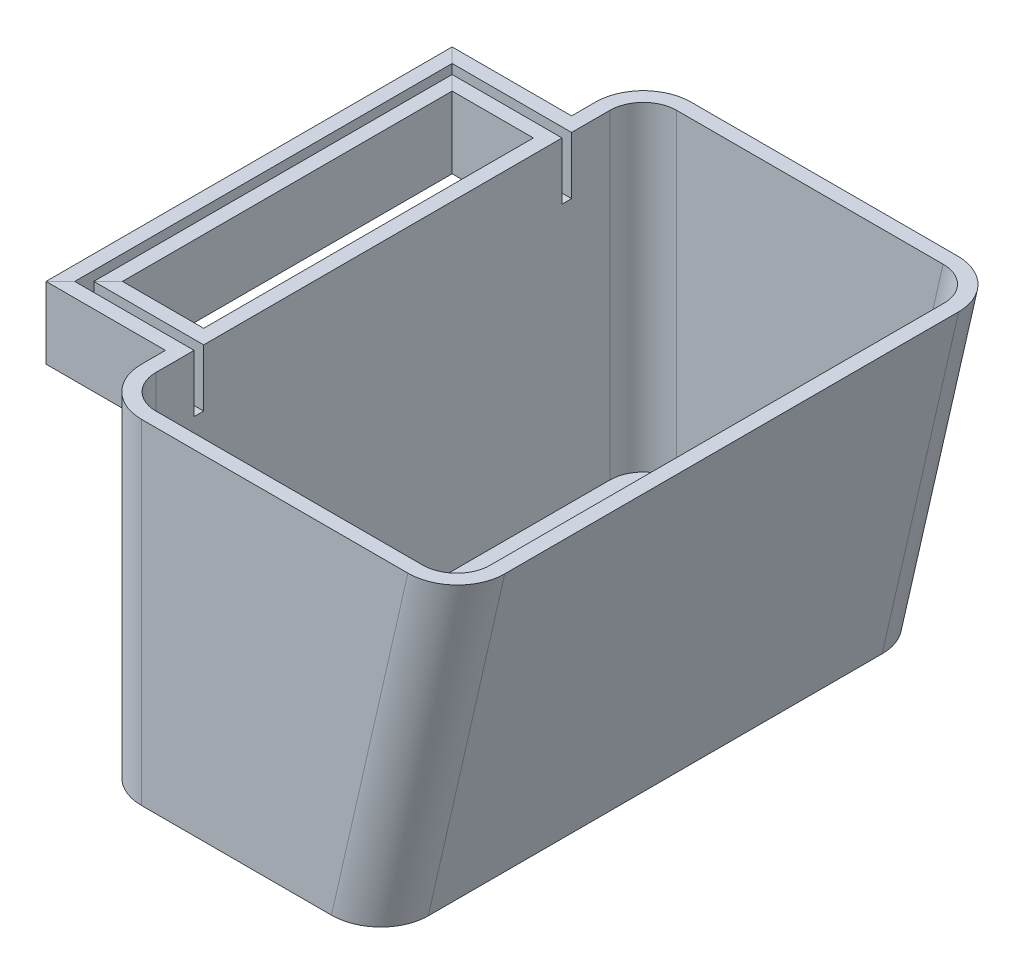
ISO-10303-21;
HEADER;
FILE_DESCRIPTION(('STEP AP214'),'2;1');
FILE_NAME('part.step','',(''),(''),'','','');
FILE_SCHEMA(('AUTOMOTIVE_DESIGN { 1 0 10303 214 1 1 1 1 }'));
ENDSEC;
DATA;
#1=APPLICATION_CONTEXT('core data for automotive mechanical design processes');
#2=APPLICATION_PROTOCOL_DEFINITION('international standard','automotive_design',2000,#1);
#3=PRODUCT_CONTEXT('',#1,'mechanical');
#4=PRODUCT('Part','Part','',(#3));
#5=PRODUCT_RELATED_PRODUCT_CATEGORY('part','',(#4));
#6=PRODUCT_DEFINITION_FORMATION('','',#4);
#7=PRODUCT_DEFINITION_CONTEXT('part definition',#1,'design');
#8=PRODUCT_DEFINITION('design','',#6,#7);
#9=PRODUCT_DEFINITION_SHAPE('','',#8);
#10=(LENGTH_UNIT() NAMED_UNIT(*) SI_UNIT(.MILLI.,.METRE.));
#11=(NAMED_UNIT(*) PLANE_ANGLE_UNIT() SI_UNIT($,.RADIAN.));
#12=(NAMED_UNIT(*) SI_UNIT($,.STERADIAN.) SOLID_ANGLE_UNIT());
#13=UNCERTAINTY_MEASURE_WITH_UNIT(LENGTH_MEASURE(1.E-05),#10,'distance_accuracy_value','');
#14=(GEOMETRIC_REPRESENTATION_CONTEXT(3) GLOBAL_UNCERTAINTY_ASSIGNED_CONTEXT((#13)) GLOBAL_UNIT_ASSIGNED_CONTEXT((#10,
#11,#12)) REPRESENTATION_CONTEXT('',''));
#15=CARTESIAN_POINT('',(0.,0.,0.));
#16=DIRECTION('',(0.,0.,1.));
#17=DIRECTION('',(1.,0.,0.));
#18=AXIS2_PLACEMENT_3D('',#15,#16,#17);
#19=CARTESIAN_POINT('',(0.,70.,115.));
#20=DIRECTION('',(0.,-1.,0.));
#21=DIRECTION('',(0.,0.,-1.));
#22=AXIS2_PLACEMENT_3D('',#19,#20,#21);
#23=PLANE('',#22);
#24=DIRECTION('',(0.,0.,-1.));
#25=VECTOR('',#24,1.);
#26=CARTESIAN_POINT('',(3.,70.,115.));
#27=LINE('',#26,#25);
#28=CARTESIAN_POINT('',(3.,70.,95.));
#29=VERTEX_POINT('',#28);
#30=CARTESIAN_POINT('',(3.,70.,20.));
#31=VERTEX_POINT('',#30);
#32=EDGE_CURVE('E398',#29,#31,#27,.T.);
#33=ORIENTED_EDGE('',*,*,#32,.T.);
#34=DIRECTION('',(-1.,0.,0.));
#35=VECTOR('',#34,1.);
#36=CARTESIAN_POINT('',(0.,70.,20.));
#37=LINE('',#36,#35);
#38=CARTESIAN_POINT('',(-20.,70.,20.));
#39=VERTEX_POINT('',#38);
#40=EDGE_CURVE('E296',#31,#39,#37,.T.);
#41=ORIENTED_EDGE('',*,*,#40,.T.);
#42=DIRECTION('',(0.707106781186548,0.,0.707106781186547));
#43=VECTOR('',#42,1.);
#44=CARTESIAN_POINT('',(-8.5,70.,31.5));
#45=LINE('',#44,#43);
#46=CARTESIAN_POINT('',(-17.,70.,23.));
#47=VERTEX_POINT('',#46);
#48=EDGE_CURVE('E466',#39,#47,#45,.T.);
#49=ORIENTED_EDGE('',*,*,#48,.T.);
#50=DIRECTION('',(-1.,0.,0.));
#51=VECTOR('',#50,1.);
#52=CARTESIAN_POINT('',(0.,70.,23.));
#53=LINE('',#52,#51);
#54=CARTESIAN_POINT('',(0.,70.,23.));
#55=VERTEX_POINT('',#54);
#56=EDGE_CURVE('E441',#55,#47,#53,.T.);
#57=ORIENTED_EDGE('',*,*,#56,.F.);
#58=DIRECTION('',(0.,0.,-1.));
#59=VECTOR('',#58,1.);
#60=CARTESIAN_POINT('',(0.,70.,115.));
#61=LINE('',#60,#59);
#62=CARTESIAN_POINT('',(0.,70.,92.));
#63=VERTEX_POINT('',#62);
#64=EDGE_CURVE('E562',#63,#55,#61,.T.);
#65=ORIENTED_EDGE('',*,*,#64,.F.);
#66=DIRECTION('',(1.,0.,0.));
#67=VECTOR('',#66,1.);
#68=CARTESIAN_POINT('',(-25.,70.,92.));
#69=LINE('',#68,#67);
#70=CARTESIAN_POINT('',(-17.,70.,92.));
#71=VERTEX_POINT('',#70);
#72=EDGE_CURVE('E503',#71,#63,#69,.T.);
#73=ORIENTED_EDGE('',*,*,#72,.F.);
#74=DIRECTION('',(0.707106781186548,0.,-0.707106781186548));
#75=VECTOR('',#74,1.);
#76=CARTESIAN_POINT('',(21.5,70.,53.5));
#77=LINE('',#76,#75);
#78=CARTESIAN_POINT('',(-20.,70.,95.));
#79=VERTEX_POINT('',#78);
#80=EDGE_CURVE('E498',#79,#71,#77,.T.);
#81=ORIENTED_EDGE('',*,*,#80,.F.);
#82=DIRECTION('',(1.,0.,0.));
#83=VECTOR('',#82,1.);
#84=CARTESIAN_POINT('',(0.,70.,95.));
#85=LINE('',#84,#83);
#86=EDGE_CURVE('E67',#79,#29,#85,.T.);
#87=ORIENTED_EDGE('',*,*,#86,.T.);
#88=EDGE_LOOP('',(#33,#41,#49,#57,#65,#73,#81,#87));
#89=FACE_BOUND('',#88,.T.);
#90=ADVANCED_FACE('F43',(#89),#23,.F.);
#91=CARTESIAN_POINT('',(-17.,70.,15.));
#92=DIRECTION('',(0.,1.,0.));
#93=DIRECTION('',(0.,0.,1.));
#94=AXIS2_PLACEMENT_3D('',#91,#92,#93);
#95=PLANE('',#94);
#96=ORIENTED_EDGE('',*,*,#48,.F.);
#97=DIRECTION('',(0.,0.,1.));
#98=VECTOR('',#97,1.);
#99=CARTESIAN_POINT('',(-20.,70.,15.));
#100=LINE('',#99,#98);
#101=EDGE_CURVE('E368',#39,#79,#100,.T.);
#102=ORIENTED_EDGE('',*,*,#101,.T.);
#103=ORIENTED_EDGE('',*,*,#80,.T.);
#104=DIRECTION('',(0.,0.,1.));
#105=VECTOR('',#104,1.);
#106=CARTESIAN_POINT('',(-17.,70.,15.));
#107=LINE('',#106,#105);
#108=EDGE_CURVE('E487',#47,#71,#107,.T.);
#109=ORIENTED_EDGE('',*,*,#108,.F.);
#110=EDGE_LOOP('',(#96,#102,#103,#109));
#111=FACE_BOUND('',#110,.T.);
#112=ADVANCED_FACE('F691',(#111),#95,.T.);
#113=CARTESIAN_POINT('',(0.,0.,115.));
#114=DIRECTION('',(1.,0.,0.));
#115=DIRECTION('',(0.,0.,-1.));
#116=AXIS2_PLACEMENT_3D('',#113,#114,#115);
#117=PLANE('',#116);
#118=CARTESIAN_POINT('',(0.,70.,15.));
#119=VERTEX_POINT('',#118);
#120=CARTESIAN_POINT('',(0.,70.,9.99999999999999));
#121=VERTEX_POINT('',#120);
#122=EDGE_CURVE('E557',#119,#121,#61,.T.);
#123=ORIENTED_EDGE('',*,*,#122,.T.);
#124=DIRECTION('',(0.,-1.,0.));
#125=VECTOR('',#124,1.);
#126=CARTESIAN_POINT('',(0.,0.,9.99999999999999));
#127=LINE('',#126,#125);
#128=CARTESIAN_POINT('',(0.,0.,9.99999999999999));
#129=VERTEX_POINT('',#128);
#130=EDGE_CURVE('E597',#121,#129,#127,.T.);
#131=ORIENTED_EDGE('',*,*,#130,.T.);
#132=DIRECTION('',(0.,0.,-1.));
#133=VECTOR('',#132,1.);
#134=CARTESIAN_POINT('',(0.,0.,115.));
#135=LINE('',#134,#133);
#136=CARTESIAN_POINT('',(0.,0.,105.));
#137=VERTEX_POINT('',#136);
#138=EDGE_CURVE('E547',#137,#129,#135,.T.);
#139=ORIENTED_EDGE('',*,*,#138,.F.);
#140=DIRECTION('',(0.,-1.,0.));
#141=VECTOR('',#140,1.);
#142=CARTESIAN_POINT('',(0.,0.,105.));
#143=LINE('',#142,#141);
#144=CARTESIAN_POINT('',(0.,70.,105.));
#145=VERTEX_POINT('',#144);
#146=EDGE_CURVE('E577',#137,#145,#143,.F.);
#147=ORIENTED_EDGE('',*,*,#146,.T.);
#148=CARTESIAN_POINT('',(0.,70.,100.));
#149=VERTEX_POINT('',#148);
#150=EDGE_CURVE('E558',#145,#149,#61,.T.);
#151=ORIENTED_EDGE('',*,*,#150,.T.);
#152=DIRECTION('',(0.,-1.,0.));
#153=VECTOR('',#152,1.);
#154=CARTESIAN_POINT('',(0.,70.,100.));
#155=LINE('',#154,#153);
#156=CARTESIAN_POINT('',(0.,55.,100.));
#157=VERTEX_POINT('',#156);
#158=EDGE_CURVE('E526',#149,#157,#155,.T.);
#159=ORIENTED_EDGE('',*,*,#158,.T.);
#160=DIRECTION('',(0.,0.,-1.));
#161=VECTOR('',#160,1.);
#162=CARTESIAN_POINT('',(0.,55.,100.));
#163=LINE('',#162,#161);
#164=CARTESIAN_POINT('',(0.,55.,92.));
#165=VERTEX_POINT('',#164);
#166=EDGE_CURVE('E518',#157,#165,#163,.T.);
#167=ORIENTED_EDGE('',*,*,#166,.T.);
#168=DIRECTION('',(0.,1.,0.));
#169=VECTOR('',#168,1.);
#170=CARTESIAN_POINT('',(0.,55.,92.));
#171=LINE('',#170,#169);
#172=EDGE_CURVE('E338',#165,#63,#171,.T.);
#173=ORIENTED_EDGE('',*,*,#172,.T.);
#174=ORIENTED_EDGE('',*,*,#64,.T.);
#175=DIRECTION('',(0.,1.,0.));
#176=VECTOR('',#175,1.);
#177=CARTESIAN_POINT('',(0.,55.,23.));
#178=LINE('',#177,#176);
#179=CARTESIAN_POINT('',(0.,55.,23.));
#180=VERTEX_POINT('',#179);
#181=EDGE_CURVE('E436',#180,#55,#178,.T.);
#182=ORIENTED_EDGE('',*,*,#181,.F.);
#183=DIRECTION('',(0.,0.,1.));
#184=VECTOR('',#183,1.);
#185=CARTESIAN_POINT('',(0.,55.,15.));
#186=LINE('',#185,#184);
#187=CARTESIAN_POINT('',(0.,55.,15.));
#188=VERTEX_POINT('',#187);
#189=EDGE_CURVE('E440',#188,#180,#186,.T.);
#190=ORIENTED_EDGE('',*,*,#189,.F.);
#191=DIRECTION('',(0.,-1.,0.));
#192=VECTOR('',#191,1.);
#193=CARTESIAN_POINT('',(0.,70.,15.));
#194=LINE('',#193,#192);
#195=EDGE_CURVE('E445',#119,#188,#194,.T.);
#196=ORIENTED_EDGE('',*,*,#195,.F.);
#197=EDGE_LOOP('',(#123,#131,#139,#147,#151,#159,#167,#173,#174,#182,#190,#196));
#198=FACE_BOUND('',#197,.T.);
#199=ADVANCED_FACE('F627',(#198),#117,.F.);
#200=CARTESIAN_POINT('',(60.,0.,115.));
#201=DIRECTION('',(0.,1.,0.));
#202=DIRECTION('',(-1.,0.,0.));
#203=AXIS2_PLACEMENT_3D('',#200,#201,#202);
#204=PLANE('',#203);
#205=ORIENTED_EDGE('',*,*,#138,.T.);
#206=CARTESIAN_POINT('',(10.,0.,9.99999999999999));
#207=DIRECTION('',(0.,1.,0.));
#208=DIRECTION('',(-1.,0.,0.));
#209=AXIS2_PLACEMENT_3D('',#206,#207,#208);
#210=CIRCLE('',#209,10.);
#211=CARTESIAN_POINT('',(10.,0.,0.));
#212=VERTEX_POINT('',#211);
#213=EDGE_CURVE('E604',#129,#212,#210,.F.);
#214=ORIENTED_EDGE('',*,*,#213,.T.);
#215=DIRECTION('',(1.,0.,0.));
#216=VECTOR('',#215,1.);
#217=CARTESIAN_POINT('',(60.,0.,0.));
#218=LINE('',#217,#216);
#219=CARTESIAN_POINT('',(49.7421011022764,0.,0.));
#220=VERTEX_POINT('',#219);
#221=EDGE_CURVE('E458',#212,#220,#218,.T.);
#222=ORIENTED_EDGE('',*,*,#221,.T.);
#223=CARTESIAN_POINT('',(49.7421011022764,0.,9.99999999999999));
#224=DIRECTION('',(0.,1.,0.));
#225=DIRECTION('',(-1.,0.,0.));
#226=AXIS2_PLACEMENT_3D('',#223,#224,#225);
#227=ELLIPSE('',#226,10.2578988977236,10.);
#228=CARTESIAN_POINT('',(60.,0.,9.99999999999999));
#229=VERTEX_POINT('',#228);
#230=EDGE_CURVE('E601',#220,#229,#227,.F.);
#231=ORIENTED_EDGE('',*,*,#230,.T.);
#232=DIRECTION('',(0.,0.,-1.));
#233=VECTOR('',#232,1.);
#234=CARTESIAN_POINT('',(60.,0.,115.));
#235=LINE('',#234,#233);
#236=CARTESIAN_POINT('',(60.,0.,105.));
#237=VERTEX_POINT('',#236);
#238=EDGE_CURVE('E566',#237,#229,#235,.T.);
#239=ORIENTED_EDGE('',*,*,#238,.F.);
#240=CARTESIAN_POINT('',(49.7421011022764,0.,105.));
#241=DIRECTION('',(0.,1.,0.));
#242=DIRECTION('',(1.,0.,0.));
#243=AXIS2_PLACEMENT_3D('',#240,#241,#242);
#244=ELLIPSE('',#243,10.2578988977236,10.);
#245=CARTESIAN_POINT('',(49.7421011022764,0.,115.));
#246=VERTEX_POINT('',#245);
#247=EDGE_CURVE('E594',#237,#246,#244,.F.);
#248=ORIENTED_EDGE('',*,*,#247,.T.);
#249=DIRECTION('',(1.,0.,0.));
#250=VECTOR('',#249,1.);
#251=CARTESIAN_POINT('',(60.,0.,115.));
#252=LINE('',#251,#250);
#253=CARTESIAN_POINT('',(10.,0.,115.));
#254=VERTEX_POINT('',#253);
#255=EDGE_CURVE('E539',#254,#246,#252,.T.);
#256=ORIENTED_EDGE('',*,*,#255,.F.);
#257=CARTESIAN_POINT('',(10.,0.,105.));
#258=DIRECTION('',(0.,1.,0.));
#259=DIRECTION('',(-1.,0.,0.));
#260=AXIS2_PLACEMENT_3D('',#257,#258,#259);
#261=CIRCLE('',#260,10.);
#262=EDGE_CURVE('E574',#254,#137,#261,.F.);
#263=ORIENTED_EDGE('',*,*,#262,.T.);
#264=EDGE_LOOP('',(#205,#214,#222,#231,#239,#248,#256,#263));
#265=FACE_BOUND('',#264,.T.);
#266=ADVANCED_FACE('F633',(#265),#204,.F.);
#267=CARTESIAN_POINT('',(76.,70.,115.));
#268=DIRECTION('',(-0.974858506571867,0.222824801502141,0.));
#269=DIRECTION('',(-0.222824801502141,-0.974858506571867,0.));
#270=AXIS2_PLACEMENT_3D('',#267,#268,#269);
#271=PLANE('',#270);
#272=ORIENTED_EDGE('',*,*,#238,.T.);
#273=DIRECTION('',(0.222824801502141,0.974858506571867,0.));
#274=VECTOR('',#273,1.);
#275=CARTESIAN_POINT('',(76.,70.,9.99999999999999));
#276=LINE('',#275,#274);
#277=CARTESIAN_POINT('',(76.,70.,9.99999999999999));
#278=VERTEX_POINT('',#277);
#279=EDGE_CURVE('E11',#229,#278,#276,.T.);
#280=ORIENTED_EDGE('',*,*,#279,.T.);
#281=DIRECTION('',(0.,0.,-1.));
#282=VECTOR('',#281,1.);
#283=CARTESIAN_POINT('',(76.,70.,115.));
#284=LINE('',#283,#282);
#285=CARTESIAN_POINT('',(76.,70.,105.));
#286=VERTEX_POINT('',#285);
#287=EDGE_CURVE('E561',#286,#278,#284,.T.);
#288=ORIENTED_EDGE('',*,*,#287,.F.);
#289=DIRECTION('',(0.222824801502141,0.974858506571867,0.));
#290=VECTOR('',#289,1.);
#291=CARTESIAN_POINT('',(76.,70.,105.));
#292=LINE('',#291,#290);
#293=EDGE_CURVE('E591',#286,#237,#292,.F.);
#294=ORIENTED_EDGE('',*,*,#293,.T.);
#295=EDGE_LOOP('',(#272,#280,#288,#294));
#296=FACE_BOUND('',#295,.T.);
#297=ADVANCED_FACE('F643',(#296),#271,.F.);
#298=DIRECTION('',(-1.,0.,0.));
#299=VECTOR('',#298,1.);
#300=CARTESIAN_POINT('',(0.,70.,18.));
#301=LINE('',#300,#299);
#302=CARTESIAN_POINT('',(3.,70.,18.));
#303=VERTEX_POINT('',#302);
#304=CARTESIAN_POINT('',(-22.,70.,18.));
#305=VERTEX_POINT('',#304);
#306=EDGE_CURVE('E59',#303,#305,#301,.T.);
#307=ORIENTED_EDGE('',*,*,#306,.F.);
#308=DIRECTION('',(0.,0.,-1.));
#309=VECTOR('',#308,1.);
#310=CARTESIAN_POINT('',(3.,70.,115.));
#311=LINE('',#310,#309);
#312=CARTESIAN_POINT('',(3.,70.,9.99999999999999));
#313=VERTEX_POINT('',#312);
#314=EDGE_CURVE('E394',#303,#313,#311,.T.);
#315=ORIENTED_EDGE('',*,*,#314,.T.);
#316=CARTESIAN_POINT('',(10.,70.,9.99999999999999));
#317=DIRECTION('',(0.,-1.,0.));
#318=DIRECTION('',(0.,0.,-1.));
#319=AXIS2_PLACEMENT_3D('',#316,#317,#318);
#320=CIRCLE('',#319,7.);
#321=CARTESIAN_POINT('',(10.,70.,3.));
#322=VERTEX_POINT('',#321);
#323=EDGE_CURVE('E339',#322,#313,#320,.F.);
#324=ORIENTED_EDGE('',*,*,#323,.F.);
#325=DIRECTION('',(-1.,0.,0.));
#326=VECTOR('',#325,1.);
#327=CARTESIAN_POINT('',(0.,70.,3.));
#328=LINE('',#327,#326);
#329=CARTESIAN_POINT('',(65.7421011022764,70.,3.));
#330=VERTEX_POINT('',#329);
#331=EDGE_CURVE('E313',#330,#322,#328,.T.);
#332=ORIENTED_EDGE('',*,*,#331,.F.);
#333=CARTESIAN_POINT('',(65.7421011022764,70.,9.99999999999999));
#334=DIRECTION('',(0.,-1.,0.));
#335=DIRECTION('',(-1.,0.,0.));
#336=AXIS2_PLACEMENT_3D('',#333,#334,#335);
#337=ELLIPSE('',#336,7.1805292284065,7.);
#338=CARTESIAN_POINT('',(72.9226303306829,70.,9.99999999999999));
#339=VERTEX_POINT('',#338);
#340=EDGE_CURVE('E354',#339,#330,#337,.F.);
#341=ORIENTED_EDGE('',*,*,#340,.F.);
#342=DIRECTION('',(0.,0.,-1.));
#343=VECTOR('',#342,1.);
#344=CARTESIAN_POINT('',(72.9226303306829,70.,115.));
#345=LINE('',#344,#343);
#346=CARTESIAN_POINT('',(72.9226303306829,70.,105.));
#347=VERTEX_POINT('',#346);
#348=EDGE_CURVE('E322',#347,#339,#345,.T.);
#349=ORIENTED_EDGE('',*,*,#348,.F.);
#350=CARTESIAN_POINT('',(65.7421011022764,70.,105.));
#351=DIRECTION('',(0.,-1.,0.));
#352=DIRECTION('',(1.,0.,0.));
#353=AXIS2_PLACEMENT_3D('',#350,#351,#352);
#354=ELLIPSE('',#353,7.1805292284065,7.);
#355=CARTESIAN_POINT('',(65.7421011022764,70.,112.));
#356=VERTEX_POINT('',#355);
#357=EDGE_CURVE('E342',#356,#347,#354,.F.);
#358=ORIENTED_EDGE('',*,*,#357,.F.);
#359=DIRECTION('',(-1.,0.,0.));
#360=VECTOR('',#359,1.);
#361=CARTESIAN_POINT('',(0.,70.,112.));
#362=LINE('',#361,#360);
#363=CARTESIAN_POINT('',(10.,70.,112.));
#364=VERTEX_POINT('',#363);
#365=EDGE_CURVE('E331',#356,#364,#362,.T.);
#366=ORIENTED_EDGE('',*,*,#365,.T.);
#367=CARTESIAN_POINT('',(10.,70.,105.));
#368=DIRECTION('',(0.,-1.,0.));
#369=DIRECTION('',(0.,0.,-1.));
#370=AXIS2_PLACEMENT_3D('',#367,#368,#369);
#371=CIRCLE('',#370,7.);
#372=CARTESIAN_POINT('',(3.,70.,105.));
#373=VERTEX_POINT('',#372);
#374=EDGE_CURVE('E346',#373,#364,#371,.F.);
#375=ORIENTED_EDGE('',*,*,#374,.F.);
#376=DIRECTION('',(0.,0.,-1.));
#377=VECTOR('',#376,1.);
#378=CARTESIAN_POINT('',(3.,70.,115.));
#379=LINE('',#378,#377);
#380=CARTESIAN_POINT('',(3.,70.,97.));
#381=VERTEX_POINT('',#380);
#382=EDGE_CURVE('E405',#373,#381,#379,.T.);
#383=ORIENTED_EDGE('',*,*,#382,.T.);
#384=DIRECTION('',(1.,0.,0.));
#385=VECTOR('',#384,1.);
#386=CARTESIAN_POINT('',(-25.,70.,97.));
#387=LINE('',#386,#385);
#388=CARTESIAN_POINT('',(-22.,70.,97.));
#389=VERTEX_POINT('',#388);
#390=EDGE_CURVE('E280',#389,#381,#387,.T.);
#391=ORIENTED_EDGE('',*,*,#390,.F.);
#392=CARTESIAN_POINT('',(-25.,70.,100.));
#393=VERTEX_POINT('',#392);
#394=EDGE_CURVE('E504',#393,#389,#77,.T.);
#395=ORIENTED_EDGE('',*,*,#394,.F.);
#396=DIRECTION('',(1.,0.,0.));
#397=VECTOR('',#396,1.);
#398=CARTESIAN_POINT('',(-25.,70.,100.));
#399=LINE('',#398,#397);
#400=EDGE_CURVE('E530',#393,#149,#399,.T.);
#401=ORIENTED_EDGE('',*,*,#400,.T.);
#402=ORIENTED_EDGE('',*,*,#150,.F.);
#403=CARTESIAN_POINT('',(10.,70.,105.));
#404=DIRECTION('',(0.,-1.,0.));
#405=DIRECTION('',(0.,0.,-1.));
#406=AXIS2_PLACEMENT_3D('',#403,#404,#405);
#407=CIRCLE('',#406,10.);
#408=CARTESIAN_POINT('',(10.,70.,115.));
#409=VERTEX_POINT('',#408);
#410=EDGE_CURVE('E580',#145,#409,#407,.F.);
#411=ORIENTED_EDGE('',*,*,#410,.T.);
#412=DIRECTION('',(-1.,0.,0.));
#413=VECTOR('',#412,1.);
#414=CARTESIAN_POINT('',(0.,70.,115.));
#415=LINE('',#414,#413);
#416=CARTESIAN_POINT('',(65.7421011022764,70.,115.));
#417=VERTEX_POINT('',#416);
#418=EDGE_CURVE('E543',#417,#409,#415,.T.);
#419=ORIENTED_EDGE('',*,*,#418,.F.);
#420=CARTESIAN_POINT('',(65.7421011022764,70.,105.));
#421=DIRECTION('',(0.,-1.,0.));
#422=DIRECTION('',(1.,0.,0.));
#423=AXIS2_PLACEMENT_3D('',#420,#421,#422);
#424=ELLIPSE('',#423,10.2578988977236,10.);
#425=EDGE_CURVE('E588',#417,#286,#424,.F.);
#426=ORIENTED_EDGE('',*,*,#425,.T.);
#427=ORIENTED_EDGE('',*,*,#287,.T.);
#428=CARTESIAN_POINT('',(65.7421011022764,70.,9.99999999999999));
#429=DIRECTION('',(0.,-1.,0.));
#430=DIRECTION('',(-1.,0.,0.));
#431=AXIS2_PLACEMENT_3D('',#428,#429,#430);
#432=ELLIPSE('',#431,10.2578988977236,10.);
#433=CARTESIAN_POINT('',(65.7421011022764,70.,0.));
#434=VERTEX_POINT('',#433);
#435=EDGE_CURVE('E613',#278,#434,#432,.F.);
#436=ORIENTED_EDGE('',*,*,#435,.T.);
#437=DIRECTION('',(-1.,0.,0.));
#438=VECTOR('',#437,1.);
#439=CARTESIAN_POINT('',(0.,70.,0.));
#440=LINE('',#439,#438);
#441=CARTESIAN_POINT('',(10.,70.,0.));
#442=VERTEX_POINT('',#441);
#443=EDGE_CURVE('E544',#434,#442,#440,.T.);
#444=ORIENTED_EDGE('',*,*,#443,.T.);
#445=CARTESIAN_POINT('',(10.,70.,9.99999999999999));
#446=DIRECTION('',(0.,-1.,0.));
#447=DIRECTION('',(0.,0.,-1.));
#448=AXIS2_PLACEMENT_3D('',#445,#446,#447);
#449=CIRCLE('',#448,10.);
#450=EDGE_CURVE('E52',#442,#121,#449,.F.);
#451=ORIENTED_EDGE('',*,*,#450,.T.);
#452=ORIENTED_EDGE('',*,*,#122,.F.);
#453=DIRECTION('',(-1.,0.,0.));
#454=VECTOR('',#453,1.);
#455=CARTESIAN_POINT('',(0.,70.,15.));
#456=LINE('',#455,#454);
#457=CARTESIAN_POINT('',(-25.,70.,15.));
#458=VERTEX_POINT('',#457);
#459=EDGE_CURVE('E454',#119,#458,#456,.T.);
#460=ORIENTED_EDGE('',*,*,#459,.T.);
#461=EDGE_CURVE('E472',#458,#305,#45,.T.);
#462=ORIENTED_EDGE('',*,*,#461,.T.);
#463=EDGE_LOOP('',(#307,#315,#324,#332,#341,#349,#358,#366,#375,#383,#391,#395,#401,#402,#411,
#419,#426,#427,#436,#444,#451,#452,#460,#462));
#464=FACE_BOUND('',#463,.T.);
#465=ADVANCED_FACE('F620',(#464),#23,.F.);
#466=CARTESIAN_POINT('',(0.,0.,115.));
#467=DIRECTION('',(0.,0.,-1.));
#468=DIRECTION('',(-1.,0.,0.));
#469=AXIS2_PLACEMENT_3D('',#466,#467,#468);
#470=PLANE('',#469);
#471=ORIENTED_EDGE('',*,*,#255,.T.);
#472=DIRECTION('',(0.222824801502141,0.974858506571867,0.));
#473=VECTOR('',#472,1.);
#474=CARTESIAN_POINT('',(47.2723614044132,-10.8051111781516,115.));
#475=LINE('',#474,#473);
#476=EDGE_CURVE('E584',#246,#417,#475,.T.);
#477=ORIENTED_EDGE('',*,*,#476,.T.);
#478=ORIENTED_EDGE('',*,*,#418,.T.);
#479=DIRECTION('',(0.,-1.,0.));
#480=VECTOR('',#479,1.);
#481=CARTESIAN_POINT('',(10.,0.,115.));
#482=LINE('',#481,#480);
#483=EDGE_CURVE('E570',#409,#254,#482,.T.);
#484=ORIENTED_EDGE('',*,*,#483,.T.);
#485=EDGE_LOOP('',(#471,#477,#478,#484));
#486=FACE_BOUND('',#485,.T.);
#487=ADVANCED_FACE('F651',(#486),#470,.F.);
#488=CARTESIAN_POINT('',(0.,0.,0.));
#489=DIRECTION('',(0.,0.,-1.));
#490=DIRECTION('',(-1.,0.,0.));
#491=AXIS2_PLACEMENT_3D('',#488,#489,#490);
#492=PLANE('',#491);
#493=ORIENTED_EDGE('',*,*,#221,.F.);
#494=DIRECTION('',(0.,-1.,0.));
#495=VECTOR('',#494,1.);
#496=CARTESIAN_POINT('',(10.,70.,0.));
#497=LINE('',#496,#495);
#498=EDGE_CURVE('E610',#212,#442,#497,.F.);
#499=ORIENTED_EDGE('',*,*,#498,.T.);
#500=ORIENTED_EDGE('',*,*,#443,.F.);
#501=DIRECTION('',(0.222824801502141,0.974858506571867,0.));
#502=VECTOR('',#501,1.);
#503=CARTESIAN_POINT('',(50.2514149342813,2.2282480150214,0.));
#504=LINE('',#503,#502);
#505=EDGE_CURVE('E607',#434,#220,#504,.F.);
#506=ORIENTED_EDGE('',*,*,#505,.T.);
#507=EDGE_LOOP('',(#493,#499,#500,#506));
#508=FACE_BOUND('',#507,.T.);
#509=ADVANCED_FACE('F636',(#508),#492,.T.);
#510=CARTESIAN_POINT('',(-25.,70.,100.));
#511=DIRECTION('',(0.,0.,1.));
#512=DIRECTION('',(0.,-1.,0.));
#513=AXIS2_PLACEMENT_3D('',#510,#511,#512);
#514=PLANE('',#513);
#515=DIRECTION('',(1.,0.,0.));
#516=VECTOR('',#515,1.);
#517=CARTESIAN_POINT('',(-25.,55.,100.));
#518=LINE('',#517,#516);
#519=CARTESIAN_POINT('',(-25.,55.,100.));
#520=VERTEX_POINT('',#519);
#521=EDGE_CURVE('E522',#520,#157,#518,.T.);
#522=ORIENTED_EDGE('',*,*,#521,.T.);
#523=ORIENTED_EDGE('',*,*,#158,.F.);
#524=ORIENTED_EDGE('',*,*,#400,.F.);
#525=DIRECTION('',(0.,-1.,0.));
#526=VECTOR('',#525,1.);
#527=CARTESIAN_POINT('',(-25.,70.,100.));
#528=LINE('',#527,#526);
#529=EDGE_CURVE('E486',#393,#520,#528,.T.);
#530=ORIENTED_EDGE('',*,*,#529,.T.);
#531=EDGE_LOOP('',(#522,#523,#524,#530));
#532=FACE_BOUND('',#531,.T.);
#533=ADVANCED_FACE('F663',(#532),#514,.T.);
#534=CARTESIAN_POINT('',(-25.,55.,100.));
#535=DIRECTION('',(0.,-1.,0.));
#536=DIRECTION('',(0.,0.,-1.));
#537=AXIS2_PLACEMENT_3D('',#534,#535,#536);
#538=PLANE('',#537);
#539=DIRECTION('',(-0.707106781186548,0.,0.707106781186548));
#540=VECTOR('',#539,1.);
#541=CARTESIAN_POINT('',(17.5,55.,57.5));
#542=LINE('',#541,#540);
#543=CARTESIAN_POINT('',(-17.,55.,92.));
#544=VERTEX_POINT('',#543);
#545=EDGE_CURVE('E499',#544,#520,#542,.T.);
#546=ORIENTED_EDGE('',*,*,#545,.F.);
#547=DIRECTION('',(1.,0.,0.));
#548=VECTOR('',#547,1.);
#549=CARTESIAN_POINT('',(-25.,55.,92.));
#550=LINE('',#549,#548);
#551=EDGE_CURVE('E517',#544,#165,#550,.T.);
#552=ORIENTED_EDGE('',*,*,#551,.T.);
#553=ORIENTED_EDGE('',*,*,#166,.F.);
#554=ORIENTED_EDGE('',*,*,#521,.F.);
#555=EDGE_LOOP('',(#546,#552,#553,#554));
#556=FACE_BOUND('',#555,.T.);
#557=ADVANCED_FACE('F832',(#556),#538,.T.);
#558=CARTESIAN_POINT('',(-25.,55.,92.));
#559=DIRECTION('',(0.,0.,-1.));
#560=DIRECTION('',(-1.,0.,0.));
#561=AXIS2_PLACEMENT_3D('',#558,#559,#560);
#562=PLANE('',#561);
#563=DIRECTION('',(0.,-1.,0.));
#564=VECTOR('',#563,1.);
#565=CARTESIAN_POINT('',(-17.,55.,92.));
#566=LINE('',#565,#564);
#567=EDGE_CURVE('E494',#71,#544,#566,.T.);
#568=ORIENTED_EDGE('',*,*,#567,.F.);
#569=ORIENTED_EDGE('',*,*,#72,.T.);
#570=ORIENTED_EDGE('',*,*,#172,.F.);
#571=ORIENTED_EDGE('',*,*,#551,.F.);
#572=EDGE_LOOP('',(#568,#569,#570,#571));
#573=FACE_BOUND('',#572,.T.);
#574=ADVANCED_FACE('F700',(#573),#562,.T.);
#575=CARTESIAN_POINT('',(-25.,70.,15.));
#576=DIRECTION('',(-1.,0.,0.));
#577=DIRECTION('',(0.,-1.,0.));
#578=AXIS2_PLACEMENT_3D('',#575,#576,#577);
#579=PLANE('',#578);
#580=DIRECTION('',(0.,0.,1.));
#581=VECTOR('',#580,1.);
#582=CARTESIAN_POINT('',(-25.,55.,15.));
#583=LINE('',#582,#581);
#584=CARTESIAN_POINT('',(-25.,55.,15.));
#585=VERTEX_POINT('',#584);
#586=EDGE_CURVE('E490',#585,#520,#583,.T.);
#587=ORIENTED_EDGE('',*,*,#586,.T.);
#588=ORIENTED_EDGE('',*,*,#529,.F.);
#589=DIRECTION('',(0.,0.,1.));
#590=VECTOR('',#589,1.);
#591=CARTESIAN_POINT('',(-25.,70.,15.));
#592=LINE('',#591,#590);
#593=EDGE_CURVE('E482',#458,#393,#592,.T.);
#594=ORIENTED_EDGE('',*,*,#593,.F.);
#595=DIRECTION('',(0.,-1.,0.));
#596=VECTOR('',#595,1.);
#597=CARTESIAN_POINT('',(-25.,70.,15.));
#598=LINE('',#597,#596);
#599=EDGE_CURVE('E450',#458,#585,#598,.T.);
#600=ORIENTED_EDGE('',*,*,#599,.T.);
#601=EDGE_LOOP('',(#587,#588,#594,#600));
#602=FACE_BOUND('',#601,.T.);
#603=ADVANCED_FACE('F667',(#602),#579,.T.);
#604=DIRECTION('',(0.,0.,1.));
#605=VECTOR('',#604,1.);
#606=CARTESIAN_POINT('',(-22.,70.,15.));
#607=LINE('',#606,#605);
#608=EDGE_CURVE('E360',#305,#389,#607,.T.);
#609=ORIENTED_EDGE('',*,*,#608,.F.);
#610=ORIENTED_EDGE('',*,*,#461,.F.);
#611=ORIENTED_EDGE('',*,*,#593,.T.);
#612=ORIENTED_EDGE('',*,*,#394,.T.);
#613=EDGE_LOOP('',(#609,#610,#611,#612));
#614=FACE_BOUND('',#613,.T.);
#615=ADVANCED_FACE('F672',(#614),#95,.T.);
#616=CARTESIAN_POINT('',(-25.,55.,15.));
#617=DIRECTION('',(0.,-1.,0.));
#618=DIRECTION('',(0.,0.,-1.));
#619=AXIS2_PLACEMENT_3D('',#616,#617,#618);
#620=PLANE('',#619);
#621=DIRECTION('',(0.,0.,1.));
#622=VECTOR('',#621,1.);
#623=CARTESIAN_POINT('',(-17.,55.,15.));
#624=LINE('',#623,#622);
#625=CARTESIAN_POINT('',(-17.,55.,23.));
#626=VERTEX_POINT('',#625);
#627=EDGE_CURVE('E471',#626,#544,#624,.T.);
#628=ORIENTED_EDGE('',*,*,#627,.T.);
#629=ORIENTED_EDGE('',*,*,#545,.T.);
#630=ORIENTED_EDGE('',*,*,#586,.F.);
#631=DIRECTION('',(-0.707106781186548,0.,-0.707106781186547));
#632=VECTOR('',#631,1.);
#633=CARTESIAN_POINT('',(-12.5,55.,27.5));
#634=LINE('',#633,#632);
#635=EDGE_CURVE('E467',#626,#585,#634,.T.);
#636=ORIENTED_EDGE('',*,*,#635,.F.);
#637=EDGE_LOOP('',(#628,#629,#630,#636));
#638=FACE_BOUND('',#637,.T.);
#639=ADVANCED_FACE('F677',(#638),#620,.T.);
#640=CARTESIAN_POINT('',(-17.,55.,15.));
#641=DIRECTION('',(1.,0.,0.));
#642=DIRECTION('',(0.,0.,-1.));
#643=AXIS2_PLACEMENT_3D('',#640,#641,#642);
#644=PLANE('',#643);
#645=ORIENTED_EDGE('',*,*,#108,.T.);
#646=ORIENTED_EDGE('',*,*,#567,.T.);
#647=ORIENTED_EDGE('',*,*,#627,.F.);
#648=DIRECTION('',(0.,-1.,0.));
#649=VECTOR('',#648,1.);
#650=CARTESIAN_POINT('',(-17.,55.,23.));
#651=LINE('',#650,#649);
#652=EDGE_CURVE('E462',#47,#626,#651,.T.);
#653=ORIENTED_EDGE('',*,*,#652,.F.);
#654=EDGE_LOOP('',(#645,#646,#647,#653));
#655=FACE_BOUND('',#654,.T.);
#656=ADVANCED_FACE('F688',(#655),#644,.T.);
#657=CARTESIAN_POINT('',(0.,70.,15.));
#658=DIRECTION('',(0.,0.,-1.));
#659=DIRECTION('',(-1.,0.,0.));
#660=AXIS2_PLACEMENT_3D('',#657,#658,#659);
#661=PLANE('',#660);
#662=DIRECTION('',(-1.,0.,0.));
#663=VECTOR('',#662,1.);
#664=CARTESIAN_POINT('',(0.,55.,15.));
#665=LINE('',#664,#663);
#666=EDGE_CURVE('E446',#188,#585,#665,.T.);
#667=ORIENTED_EDGE('',*,*,#666,.T.);
#668=ORIENTED_EDGE('',*,*,#599,.F.);
#669=ORIENTED_EDGE('',*,*,#459,.F.);
#670=ORIENTED_EDGE('',*,*,#195,.T.);
#671=EDGE_LOOP('',(#667,#668,#669,#670));
#672=FACE_BOUND('',#671,.T.);
#673=ADVANCED_FACE('F674',(#672),#661,.T.);
#674=CARTESIAN_POINT('',(0.,55.,15.));
#675=DIRECTION('',(0.,-1.,0.));
#676=DIRECTION('',(0.,0.,-1.));
#677=AXIS2_PLACEMENT_3D('',#674,#675,#676);
#678=PLANE('',#677);
#679=DIRECTION('',(-1.,0.,0.));
#680=VECTOR('',#679,1.);
#681=CARTESIAN_POINT('',(0.,55.,23.));
#682=LINE('',#681,#680);
#683=EDGE_CURVE('E451',#180,#626,#682,.T.);
#684=ORIENTED_EDGE('',*,*,#683,.T.);
#685=ORIENTED_EDGE('',*,*,#635,.T.);
#686=ORIENTED_EDGE('',*,*,#666,.F.);
#687=ORIENTED_EDGE('',*,*,#189,.T.);
#688=EDGE_LOOP('',(#684,#685,#686,#687));
#689=FACE_BOUND('',#688,.T.);
#690=ADVANCED_FACE('F680',(#689),#678,.T.);
#691=CARTESIAN_POINT('',(0.,55.,23.));
#692=DIRECTION('',(0.,0.,1.));
#693=DIRECTION('',(1.,0.,0.));
#694=AXIS2_PLACEMENT_3D('',#691,#692,#693);
#695=PLANE('',#694);
#696=ORIENTED_EDGE('',*,*,#56,.T.);
#697=ORIENTED_EDGE('',*,*,#652,.T.);
#698=ORIENTED_EDGE('',*,*,#683,.F.);
#699=ORIENTED_EDGE('',*,*,#181,.T.);
#700=EDGE_LOOP('',(#696,#697,#698,#699));
#701=FACE_BOUND('',#700,.T.);
#702=ADVANCED_FACE('F683',(#701),#695,.T.);
#703=CARTESIAN_POINT('',(10.,0.,105.));
#704=DIRECTION('',(0.,-1.,0.));
#705=DIRECTION('',(0.,0.,-1.));
#706=AXIS2_PLACEMENT_3D('',#703,#704,#705);
#707=CYLINDRICAL_SURFACE('',#706,10.);
#708=ORIENTED_EDGE('',*,*,#410,.F.);
#709=ORIENTED_EDGE('',*,*,#146,.F.);
#710=ORIENTED_EDGE('',*,*,#262,.F.);
#711=ORIENTED_EDGE('',*,*,#483,.F.);
#712=EDGE_LOOP('',(#708,#709,#710,#711));
#713=FACE_BOUND('',#712,.T.);
#714=ADVANCED_FACE('F656',(#713),#707,.T.);
#715=CARTESIAN_POINT('',(47.2723614044132,-10.8051111781516,105.));
#716=DIRECTION('',(0.222824801502141,0.974858506571867,0.));
#717=DIRECTION('',(-0.974858506571867,0.222824801502141,0.));
#718=AXIS2_PLACEMENT_3D('',#715,#716,#717);
#719=CYLINDRICAL_SURFACE('',#718,10.);
#720=ORIENTED_EDGE('',*,*,#247,.F.);
#721=ORIENTED_EDGE('',*,*,#293,.F.);
#722=ORIENTED_EDGE('',*,*,#425,.F.);
#723=ORIENTED_EDGE('',*,*,#476,.F.);
#724=EDGE_LOOP('',(#720,#721,#722,#723));
#725=FACE_BOUND('',#724,.T.);
#726=ADVANCED_FACE('F647',(#725),#719,.T.);
#727=CARTESIAN_POINT('',(10.,0.,9.99999999999999));
#728=DIRECTION('',(0.,1.,0.));
#729=DIRECTION('',(0.,0.,1.));
#730=AXIS2_PLACEMENT_3D('',#727,#728,#729);
#731=CYLINDRICAL_SURFACE('',#730,10.);
#732=ORIENTED_EDGE('',*,*,#450,.F.);
#733=ORIENTED_EDGE('',*,*,#498,.F.);
#734=ORIENTED_EDGE('',*,*,#213,.F.);
#735=ORIENTED_EDGE('',*,*,#130,.F.);
#736=EDGE_LOOP('',(#732,#733,#734,#735));
#737=FACE_BOUND('',#736,.T.);
#738=ADVANCED_FACE('F630',(#737),#731,.T.);
#739=CARTESIAN_POINT('',(66.2514149342813,72.2282480150214,9.99999999999999));
#740=DIRECTION('',(-0.222824801502141,-0.974858506571867,0.));
#741=DIRECTION('',(0.974858506571867,-0.222824801502141,0.));
#742=AXIS2_PLACEMENT_3D('',#739,#740,#741);
#743=CYLINDRICAL_SURFACE('',#742,10.);
#744=ORIENTED_EDGE('',*,*,#230,.F.);
#745=ORIENTED_EDGE('',*,*,#505,.F.);
#746=ORIENTED_EDGE('',*,*,#435,.F.);
#747=ORIENTED_EDGE('',*,*,#279,.F.);
#748=EDGE_LOOP('',(#744,#745,#746,#747));
#749=FACE_BOUND('',#748,.T.);
#750=ADVANCED_FACE('F45',(#749),#743,.T.);
#751=CARTESIAN_POINT('',(3.,0.,115.));
#752=DIRECTION('',(1.,0.,0.));
#753=DIRECTION('',(0.,0.,-1.));
#754=AXIS2_PLACEMENT_3D('',#751,#752,#753);
#755=PLANE('',#754);
#756=ORIENTED_EDGE('',*,*,#314,.F.);
#757=DIRECTION('',(0.,-1.,0.));
#758=VECTOR('',#757,1.);
#759=CARTESIAN_POINT('',(3.,70.,18.));
#760=LINE('',#759,#758);
#761=CARTESIAN_POINT('',(3.,58.,18.));
#762=VERTEX_POINT('',#761);
#763=EDGE_CURVE('E300',#303,#762,#760,.T.);
#764=ORIENTED_EDGE('',*,*,#763,.T.);
#765=DIRECTION('',(0.,0.,1.));
#766=VECTOR('',#765,1.);
#767=CARTESIAN_POINT('',(3.,58.,15.));
#768=LINE('',#767,#766);
#769=CARTESIAN_POINT('',(3.,58.,20.));
#770=VERTEX_POINT('',#769);
#771=EDGE_CURVE('E295',#762,#770,#768,.T.);
#772=ORIENTED_EDGE('',*,*,#771,.T.);
#773=DIRECTION('',(0.,1.,0.));
#774=VECTOR('',#773,1.);
#775=CARTESIAN_POINT('',(3.,55.,20.));
#776=LINE('',#775,#774);
#777=EDGE_CURVE('E292',#770,#31,#776,.T.);
#778=ORIENTED_EDGE('',*,*,#777,.T.);
#779=ORIENTED_EDGE('',*,*,#32,.F.);
#780=DIRECTION('',(0.,1.,0.));
#781=VECTOR('',#780,1.);
#782=CARTESIAN_POINT('',(3.,0.,95.));
#783=LINE('',#782,#781);
#784=CARTESIAN_POINT('',(3.,58.,95.));
#785=VERTEX_POINT('',#784);
#786=EDGE_CURVE('E262',#785,#29,#783,.T.);
#787=ORIENTED_EDGE('',*,*,#786,.F.);
#788=DIRECTION('',(0.,0.,-1.));
#789=VECTOR('',#788,1.);
#790=CARTESIAN_POINT('',(3.,58.,115.));
#791=LINE('',#790,#789);
#792=CARTESIAN_POINT('',(3.,58.,97.));
#793=VERTEX_POINT('',#792);
#794=EDGE_CURVE('E253',#793,#785,#791,.T.);
#795=ORIENTED_EDGE('',*,*,#794,.F.);
#796=DIRECTION('',(0.,-1.,0.));
#797=VECTOR('',#796,1.);
#798=CARTESIAN_POINT('',(3.,0.,97.));
#799=LINE('',#798,#797);
#800=EDGE_CURVE('E259',#381,#793,#799,.T.);
#801=ORIENTED_EDGE('',*,*,#800,.F.);
#802=ORIENTED_EDGE('',*,*,#382,.F.);
#803=DIRECTION('',(0.,1.,0.));
#804=VECTOR('',#803,1.);
#805=CARTESIAN_POINT('',(3.,0.,105.));
#806=LINE('',#805,#804);
#807=CARTESIAN_POINT('',(3.,3.,105.));
#808=VERTEX_POINT('',#807);
#809=EDGE_CURVE('E287',#808,#373,#806,.T.);
#810=ORIENTED_EDGE('',*,*,#809,.F.);
#811=DIRECTION('',(0.,0.,-1.));
#812=VECTOR('',#811,1.);
#813=CARTESIAN_POINT('',(3.,3.,115.));
#814=LINE('',#813,#812);
#815=CARTESIAN_POINT('',(3.,3.,9.99999999999999));
#816=VERTEX_POINT('',#815);
#817=EDGE_CURVE('E399',#808,#816,#814,.T.);
#818=ORIENTED_EDGE('',*,*,#817,.T.);
#819=DIRECTION('',(0.,1.,0.));
#820=VECTOR('',#819,1.);
#821=CARTESIAN_POINT('',(3.,0.,9.99999999999999));
#822=LINE('',#821,#820);
#823=EDGE_CURVE('E316',#313,#816,#822,.F.);
#824=ORIENTED_EDGE('',*,*,#823,.F.);
#825=EDGE_LOOP('',(#756,#764,#772,#778,#779,#787,#795,#801,#802,#810,#818,#824));
#826=FACE_BOUND('',#825,.T.);
#827=ADVANCED_FACE('F256',(#826),#755,.T.);
#828=CARTESIAN_POINT('',(60.,3.,115.));
#829=DIRECTION('',(0.,1.,0.));
#830=DIRECTION('',(-1.,0.,0.));
#831=AXIS2_PLACEMENT_3D('',#828,#829,#830);
#832=PLANE('',#831);
#833=ORIENTED_EDGE('',*,*,#817,.F.);
#834=CARTESIAN_POINT('',(10.,3.,105.));
#835=DIRECTION('',(0.,1.,0.));
#836=DIRECTION('',(-1.,0.,0.));
#837=AXIS2_PLACEMENT_3D('',#834,#835,#836);
#838=CIRCLE('',#837,7.);
#839=CARTESIAN_POINT('',(10.,3.,112.));
#840=VERTEX_POINT('',#839);
#841=EDGE_CURVE('E332',#840,#808,#838,.F.);
#842=ORIENTED_EDGE('',*,*,#841,.F.);
#843=DIRECTION('',(1.,0.,0.));
#844=VECTOR('',#843,1.);
#845=CARTESIAN_POINT('',(0.,3.,112.));
#846=LINE('',#845,#844);
#847=CARTESIAN_POINT('',(50.4278153879907,3.,112.));
#848=VERTEX_POINT('',#847);
#849=EDGE_CURVE('E327',#840,#848,#846,.T.);
#850=ORIENTED_EDGE('',*,*,#849,.T.);
#851=CARTESIAN_POINT('',(50.4278153879907,3.,105.));
#852=DIRECTION('',(0.,1.,0.));
#853=DIRECTION('',(1.,0.,0.));
#854=AXIS2_PLACEMENT_3D('',#851,#852,#853);
#855=ELLIPSE('',#854,7.1805292284065,7.);
#856=CARTESIAN_POINT('',(57.6083446163972,3.,105.));
#857=VERTEX_POINT('',#856);
#858=EDGE_CURVE('E323',#857,#848,#855,.F.);
#859=ORIENTED_EDGE('',*,*,#858,.F.);
#860=DIRECTION('',(0.,0.,-1.));
#861=VECTOR('',#860,1.);
#862=CARTESIAN_POINT('',(57.6083446163972,3.,115.));
#863=LINE('',#862,#861);
#864=CARTESIAN_POINT('',(57.6083446163972,3.,9.99999999999999));
#865=VERTEX_POINT('',#864);
#866=EDGE_CURVE('E317',#857,#865,#863,.T.);
#867=ORIENTED_EDGE('',*,*,#866,.T.);
#868=CARTESIAN_POINT('',(50.4278153879907,3.,9.99999999999999));
#869=DIRECTION('',(0.,1.,0.));
#870=DIRECTION('',(-1.,0.,0.));
#871=AXIS2_PLACEMENT_3D('',#868,#869,#870);
#872=ELLIPSE('',#871,7.1805292284065,7.);
#873=CARTESIAN_POINT('',(50.4278153879907,3.,2.99999999999999));
#874=VERTEX_POINT('',#873);
#875=EDGE_CURVE('E309',#874,#865,#872,.F.);
#876=ORIENTED_EDGE('',*,*,#875,.F.);
#877=DIRECTION('',(1.,0.,0.));
#878=VECTOR('',#877,1.);
#879=CARTESIAN_POINT('',(0.,3.,3.));
#880=LINE('',#879,#878);
#881=CARTESIAN_POINT('',(10.,3.,3.));
#882=VERTEX_POINT('',#881);
#883=EDGE_CURVE('E304',#882,#874,#880,.T.);
#884=ORIENTED_EDGE('',*,*,#883,.F.);
#885=CARTESIAN_POINT('',(10.,3.,9.99999999999999));
#886=DIRECTION('',(0.,1.,0.));
#887=DIRECTION('',(-1.,0.,0.));
#888=AXIS2_PLACEMENT_3D('',#885,#886,#887);
#889=CIRCLE('',#888,7.);
#890=EDGE_CURVE('E305',#816,#882,#889,.F.);
#891=ORIENTED_EDGE('',*,*,#890,.F.);
#892=EDGE_LOOP('',(#833,#842,#850,#859,#867,#876,#884,#891));
#893=FACE_BOUND('',#892,.T.);
#894=ADVANCED_FACE('F714',(#893),#832,.T.);
#895=CARTESIAN_POINT('',(73.0754244802844,70.6684744045064,115.));
#896=DIRECTION('',(-0.974858506571867,0.222824801502141,0.));
#897=DIRECTION('',(-0.222824801502141,-0.974858506571867,0.));
#898=AXIS2_PLACEMENT_3D('',#895,#896,#897);
#899=PLANE('',#898);
#900=ORIENTED_EDGE('',*,*,#866,.F.);
#901=DIRECTION('',(-0.222824801502141,-0.974858506571867,0.));
#902=VECTOR('',#901,1.);
#903=CARTESIAN_POINT('',(73.0754244802844,70.6684744045064,105.));
#904=LINE('',#903,#902);
#905=EDGE_CURVE('E326',#347,#857,#904,.T.);
#906=ORIENTED_EDGE('',*,*,#905,.F.);
#907=ORIENTED_EDGE('',*,*,#348,.T.);
#908=DIRECTION('',(-0.222824801502141,-0.974858506571867,0.));
#909=VECTOR('',#908,1.);
#910=CARTESIAN_POINT('',(73.0754244802844,70.6684744045064,9.99999999999999));
#911=LINE('',#910,#909);
#912=EDGE_CURVE('E335',#865,#339,#911,.F.);
#913=ORIENTED_EDGE('',*,*,#912,.F.);
#914=EDGE_LOOP('',(#900,#906,#907,#913));
#915=FACE_BOUND('',#914,.T.);
#916=ADVANCED_FACE('F780',(#915),#899,.T.);
#917=CARTESIAN_POINT('',(0.,0.,112.));
#918=DIRECTION('',(0.,0.,-1.));
#919=DIRECTION('',(-1.,0.,0.));
#920=AXIS2_PLACEMENT_3D('',#917,#918,#919);
#921=PLANE('',#920);
#922=ORIENTED_EDGE('',*,*,#849,.F.);
#923=DIRECTION('',(0.,1.,0.));
#924=VECTOR('',#923,1.);
#925=CARTESIAN_POINT('',(10.,0.,112.));
#926=LINE('',#925,#924);
#927=EDGE_CURVE('E321',#364,#840,#926,.F.);
#928=ORIENTED_EDGE('',*,*,#927,.F.);
#929=ORIENTED_EDGE('',*,*,#365,.F.);
#930=DIRECTION('',(0.222824801502141,0.974858506571867,0.));
#931=VECTOR('',#930,1.);
#932=CARTESIAN_POINT('',(47.2723614044132,-10.8051111781516,112.));
#933=LINE('',#932,#931);
#934=EDGE_CURVE('E343',#848,#356,#933,.T.);
#935=ORIENTED_EDGE('',*,*,#934,.F.);
#936=EDGE_LOOP('',(#922,#928,#929,#935));
#937=FACE_BOUND('',#936,.T.);
#938=ADVANCED_FACE('F785',(#937),#921,.T.);
#939=CARTESIAN_POINT('',(0.,0.,3.));
#940=DIRECTION('',(0.,0.,-1.));
#941=DIRECTION('',(-1.,0.,0.));
#942=AXIS2_PLACEMENT_3D('',#939,#940,#941);
#943=PLANE('',#942);
#944=ORIENTED_EDGE('',*,*,#883,.T.);
#945=DIRECTION('',(-0.222824801502141,-0.974858506571867,0.));
#946=VECTOR('',#945,1.);
#947=CARTESIAN_POINT('',(66.2514149342813,72.2282480150214,2.99999999999999));
#948=LINE('',#947,#946);
#949=EDGE_CURVE('E308',#330,#874,#948,.T.);
#950=ORIENTED_EDGE('',*,*,#949,.F.);
#951=ORIENTED_EDGE('',*,*,#331,.T.);
#952=DIRECTION('',(0.,1.,0.));
#953=VECTOR('',#952,1.);
#954=CARTESIAN_POINT('',(10.,0.,3.));
#955=LINE('',#954,#953);
#956=EDGE_CURVE('E352',#882,#322,#955,.T.);
#957=ORIENTED_EDGE('',*,*,#956,.F.);
#958=EDGE_LOOP('',(#944,#950,#951,#957));
#959=FACE_BOUND('',#958,.T.);
#960=ADVANCED_FACE('F789',(#959),#943,.F.);
#961=CARTESIAN_POINT('',(-25.,70.,97.));
#962=DIRECTION('',(0.,0.,1.));
#963=DIRECTION('',(0.,-1.,0.));
#964=AXIS2_PLACEMENT_3D('',#961,#962,#963);
#965=PLANE('',#964);
#966=DIRECTION('',(1.,0.,0.));
#967=VECTOR('',#966,1.);
#968=CARTESIAN_POINT('',(-25.,58.,97.));
#969=LINE('',#968,#967);
#970=CARTESIAN_POINT('',(-22.,58.,97.));
#971=VERTEX_POINT('',#970);
#972=EDGE_CURVE('E267',#971,#793,#969,.T.);
#973=ORIENTED_EDGE('',*,*,#972,.F.);
#974=DIRECTION('',(0.,-1.,0.));
#975=VECTOR('',#974,1.);
#976=CARTESIAN_POINT('',(-22.,70.,97.));
#977=LINE('',#976,#975);
#978=EDGE_CURVE('E356',#389,#971,#977,.T.);
#979=ORIENTED_EDGE('',*,*,#978,.F.);
#980=ORIENTED_EDGE('',*,*,#390,.T.);
#981=ORIENTED_EDGE('',*,*,#800,.T.);
#982=EDGE_LOOP('',(#973,#979,#980,#981));
#983=FACE_BOUND('',#982,.T.);
#984=ADVANCED_FACE('F278',(#983),#965,.F.);
#985=CARTESIAN_POINT('',(-25.,58.,100.));
#986=DIRECTION('',(0.,-1.,0.));
#987=DIRECTION('',(0.,0.,-1.));
#988=AXIS2_PLACEMENT_3D('',#985,#986,#987);
#989=PLANE('',#988);
#990=DIRECTION('',(-0.707106781186548,0.,0.707106781186548));
#991=VECTOR('',#990,1.);
#992=CARTESIAN_POINT('',(17.5,58.,57.5));
#993=LINE('',#992,#991);
#994=CARTESIAN_POINT('',(-20.,58.,95.));
#995=VERTEX_POINT('',#994);
#996=EDGE_CURVE('E273',#995,#971,#993,.T.);
#997=ORIENTED_EDGE('',*,*,#996,.T.);
#998=ORIENTED_EDGE('',*,*,#972,.T.);
#999=ORIENTED_EDGE('',*,*,#794,.T.);
#1000=DIRECTION('',(1.,0.,0.));
#1001=VECTOR('',#1000,1.);
#1002=CARTESIAN_POINT('',(-25.,58.,95.));
#1003=LINE('',#1002,#1001);
#1004=EDGE_CURVE('E268',#995,#785,#1003,.T.);
#1005=ORIENTED_EDGE('',*,*,#1004,.F.);
#1006=EDGE_LOOP('',(#997,#998,#999,#1005));
#1007=FACE_BOUND('',#1006,.T.);
#1008=ADVANCED_FACE('F272',(#1007),#989,.F.);
#1009=CARTESIAN_POINT('',(-25.,55.,95.));
#1010=DIRECTION('',(0.,0.,-1.));
#1011=DIRECTION('',(-1.,0.,0.));
#1012=AXIS2_PLACEMENT_3D('',#1009,#1010,#1011);
#1013=PLANE('',#1012);
#1014=DIRECTION('',(0.,-1.,0.));
#1015=VECTOR('',#1014,1.);
#1016=CARTESIAN_POINT('',(-20.,55.,95.));
#1017=LINE('',#1016,#1015);
#1018=EDGE_CURVE('E363',#79,#995,#1017,.T.);
#1019=ORIENTED_EDGE('',*,*,#1018,.T.);
#1020=ORIENTED_EDGE('',*,*,#1004,.T.);
#1021=ORIENTED_EDGE('',*,*,#786,.T.);
#1022=ORIENTED_EDGE('',*,*,#86,.F.);
#1023=EDGE_LOOP('',(#1019,#1020,#1021,#1022));
#1024=FACE_BOUND('',#1023,.T.);
#1025=ADVANCED_FACE('F735',(#1024),#1013,.F.);
#1026=CARTESIAN_POINT('',(-22.,70.,15.));
#1027=DIRECTION('',(-1.,0.,0.));
#1028=DIRECTION('',(0.,-1.,0.));
#1029=AXIS2_PLACEMENT_3D('',#1026,#1027,#1028);
#1030=PLANE('',#1029);
#1031=DIRECTION('',(0.,0.,1.));
#1032=VECTOR('',#1031,1.);
#1033=CARTESIAN_POINT('',(-22.,58.,15.));
#1034=LINE('',#1033,#1032);
#1035=CARTESIAN_POINT('',(-22.,58.,18.));
#1036=VERTEX_POINT('',#1035);
#1037=EDGE_CURVE('E359',#1036,#971,#1034,.T.);
#1038=ORIENTED_EDGE('',*,*,#1037,.F.);
#1039=DIRECTION('',(0.,-1.,0.));
#1040=VECTOR('',#1039,1.);
#1041=CARTESIAN_POINT('',(-22.,70.,18.));
#1042=LINE('',#1041,#1040);
#1043=EDGE_CURVE('E380',#305,#1036,#1042,.T.);
#1044=ORIENTED_EDGE('',*,*,#1043,.F.);
#1045=ORIENTED_EDGE('',*,*,#608,.T.);
#1046=ORIENTED_EDGE('',*,*,#978,.T.);
#1047=EDGE_LOOP('',(#1038,#1044,#1045,#1046));
#1048=FACE_BOUND('',#1047,.T.);
#1049=ADVANCED_FACE('F737',(#1048),#1030,.F.);
#1050=CARTESIAN_POINT('',(-25.,58.,15.));
#1051=DIRECTION('',(0.,-1.,0.));
#1052=DIRECTION('',(0.,0.,-1.));
#1053=AXIS2_PLACEMENT_3D('',#1050,#1051,#1052);
#1054=PLANE('',#1053);
#1055=DIRECTION('',(0.,0.,1.));
#1056=VECTOR('',#1055,1.);
#1057=CARTESIAN_POINT('',(-20.,58.,15.));
#1058=LINE('',#1057,#1056);
#1059=CARTESIAN_POINT('',(-20.,58.,20.));
#1060=VERTEX_POINT('',#1059);
#1061=EDGE_CURVE('E369',#1060,#995,#1058,.T.);
#1062=ORIENTED_EDGE('',*,*,#1061,.F.);
#1063=DIRECTION('',(-0.707106781186548,0.,-0.707106781186547));
#1064=VECTOR('',#1063,1.);
#1065=CARTESIAN_POINT('',(-12.5,58.,27.5));
#1066=LINE('',#1065,#1064);
#1067=EDGE_CURVE('E373',#1060,#1036,#1066,.T.);
#1068=ORIENTED_EDGE('',*,*,#1067,.T.);
#1069=ORIENTED_EDGE('',*,*,#1037,.T.);
#1070=ORIENTED_EDGE('',*,*,#996,.F.);
#1071=EDGE_LOOP('',(#1062,#1068,#1069,#1070));
#1072=FACE_BOUND('',#1071,.T.);
#1073=ADVANCED_FACE('F743',(#1072),#1054,.F.);
#1074=CARTESIAN_POINT('',(-20.,55.,15.));
#1075=DIRECTION('',(1.,0.,0.));
#1076=DIRECTION('',(0.,0.,-1.));
#1077=AXIS2_PLACEMENT_3D('',#1074,#1075,#1076);
#1078=PLANE('',#1077);
#1079=ORIENTED_EDGE('',*,*,#101,.F.);
#1080=DIRECTION('',(0.,-1.,0.));
#1081=VECTOR('',#1080,1.);
#1082=CARTESIAN_POINT('',(-20.,55.,20.));
#1083=LINE('',#1082,#1081);
#1084=EDGE_CURVE('E379',#39,#1060,#1083,.T.);
#1085=ORIENTED_EDGE('',*,*,#1084,.T.);
#1086=ORIENTED_EDGE('',*,*,#1061,.T.);
#1087=ORIENTED_EDGE('',*,*,#1018,.F.);
#1088=EDGE_LOOP('',(#1079,#1085,#1086,#1087));
#1089=FACE_BOUND('',#1088,.T.);
#1090=ADVANCED_FACE('F734',(#1089),#1078,.F.);
#1091=CARTESIAN_POINT('',(0.,70.,18.));
#1092=DIRECTION('',(0.,0.,-1.));
#1093=DIRECTION('',(-1.,0.,0.));
#1094=AXIS2_PLACEMENT_3D('',#1091,#1092,#1093);
#1095=PLANE('',#1094);
#1096=DIRECTION('',(-1.,0.,0.));
#1097=VECTOR('',#1096,1.);
#1098=CARTESIAN_POINT('',(0.,58.,18.));
#1099=LINE('',#1098,#1097);
#1100=EDGE_CURVE('E383',#762,#1036,#1099,.T.);
#1101=ORIENTED_EDGE('',*,*,#1100,.F.);
#1102=ORIENTED_EDGE('',*,*,#763,.F.);
#1103=ORIENTED_EDGE('',*,*,#306,.T.);
#1104=ORIENTED_EDGE('',*,*,#1043,.T.);
#1105=EDGE_LOOP('',(#1101,#1102,#1103,#1104));
#1106=FACE_BOUND('',#1105,.T.);
#1107=ADVANCED_FACE('F725',(#1106),#1095,.F.);
#1108=CARTESIAN_POINT('',(0.,58.,15.));
#1109=DIRECTION('',(0.,-1.,0.));
#1110=DIRECTION('',(0.,0.,-1.));
#1111=AXIS2_PLACEMENT_3D('',#1108,#1109,#1110);
#1112=PLANE('',#1111);
#1113=DIRECTION('',(-1.,0.,0.));
#1114=VECTOR('',#1113,1.);
#1115=CARTESIAN_POINT('',(0.,58.,20.));
#1116=LINE('',#1115,#1114);
#1117=EDGE_CURVE('E387',#770,#1060,#1116,.T.);
#1118=ORIENTED_EDGE('',*,*,#1117,.F.);
#1119=ORIENTED_EDGE('',*,*,#771,.F.);
#1120=ORIENTED_EDGE('',*,*,#1100,.T.);
#1121=ORIENTED_EDGE('',*,*,#1067,.F.);
#1122=EDGE_LOOP('',(#1118,#1119,#1120,#1121));
#1123=FACE_BOUND('',#1122,.T.);
#1124=ADVANCED_FACE('F728',(#1123),#1112,.F.);
#1125=CARTESIAN_POINT('',(0.,55.,20.));
#1126=DIRECTION('',(0.,0.,1.));
#1127=DIRECTION('',(1.,0.,0.));
#1128=AXIS2_PLACEMENT_3D('',#1125,#1126,#1127);
#1129=PLANE('',#1128);
#1130=ORIENTED_EDGE('',*,*,#40,.F.);
#1131=ORIENTED_EDGE('',*,*,#777,.F.);
#1132=ORIENTED_EDGE('',*,*,#1117,.T.);
#1133=ORIENTED_EDGE('',*,*,#1084,.F.);
#1134=EDGE_LOOP('',(#1130,#1131,#1132,#1133));
#1135=FACE_BOUND('',#1134,.T.);
#1136=ADVANCED_FACE('F732',(#1135),#1129,.F.);
#1137=CARTESIAN_POINT('',(10.,0.,105.));
#1138=DIRECTION('',(0.,-1.,0.));
#1139=DIRECTION('',(0.,0.,-1.));
#1140=AXIS2_PLACEMENT_3D('',#1137,#1138,#1139);
#1141=CYLINDRICAL_SURFACE('',#1140,7.);
#1142=ORIENTED_EDGE('',*,*,#374,.T.);
#1143=ORIENTED_EDGE('',*,*,#927,.T.);
#1144=ORIENTED_EDGE('',*,*,#841,.T.);
#1145=ORIENTED_EDGE('',*,*,#809,.T.);
#1146=EDGE_LOOP('',(#1142,#1143,#1144,#1145));
#1147=FACE_BOUND('',#1146,.T.);
#1148=ADVANCED_FACE('F795',(#1147),#1141,.F.);
#1149=CARTESIAN_POINT('',(47.2723614044132,-10.8051111781516,105.));
#1150=DIRECTION('',(0.222824801502141,0.974858506571867,0.));
#1151=DIRECTION('',(-0.974858506571867,0.222824801502141,0.));
#1152=AXIS2_PLACEMENT_3D('',#1149,#1150,#1151);
#1153=CYLINDRICAL_SURFACE('',#1152,7.);
#1154=ORIENTED_EDGE('',*,*,#858,.T.);
#1155=ORIENTED_EDGE('',*,*,#934,.T.);
#1156=ORIENTED_EDGE('',*,*,#357,.T.);
#1157=ORIENTED_EDGE('',*,*,#905,.T.);
#1158=EDGE_LOOP('',(#1154,#1155,#1156,#1157));
#1159=FACE_BOUND('',#1158,.T.);
#1160=ADVANCED_FACE('F799',(#1159),#1153,.F.);
#1161=CARTESIAN_POINT('',(10.,0.,9.99999999999999));
#1162=DIRECTION('',(0.,1.,0.));
#1163=DIRECTION('',(0.,0.,1.));
#1164=AXIS2_PLACEMENT_3D('',#1161,#1162,#1163);
#1165=CYLINDRICAL_SURFACE('',#1164,7.);
#1166=ORIENTED_EDGE('',*,*,#323,.T.);
#1167=ORIENTED_EDGE('',*,*,#823,.T.);
#1168=ORIENTED_EDGE('',*,*,#890,.T.);
#1169=ORIENTED_EDGE('',*,*,#956,.T.);
#1170=EDGE_LOOP('',(#1166,#1167,#1168,#1169));
#1171=FACE_BOUND('',#1170,.T.);
#1172=ADVANCED_FACE('F719',(#1171),#1165,.F.);
#1173=CARTESIAN_POINT('',(66.2514149342813,72.2282480150214,9.99999999999999));
#1174=DIRECTION('',(-0.222824801502141,-0.974858506571867,0.));
#1175=DIRECTION('',(0.974858506571867,-0.222824801502141,0.));
#1176=AXIS2_PLACEMENT_3D('',#1173,#1174,#1175);
#1177=CYLINDRICAL_SURFACE('',#1176,7.);
#1178=ORIENTED_EDGE('',*,*,#875,.T.);
#1179=ORIENTED_EDGE('',*,*,#912,.T.);
#1180=ORIENTED_EDGE('',*,*,#340,.T.);
#1181=ORIENTED_EDGE('',*,*,#949,.T.);
#1182=EDGE_LOOP('',(#1178,#1179,#1180,#1181));
#1183=FACE_BOUND('',#1182,.T.);
#1184=ADVANCED_FACE('F813',(#1183),#1177,.F.);
#1185=CLOSED_SHELL('',(#90,#112,#199,#266,#297,#465,#487,#509,#533,#557,#574,#603,#615,#639,
#656,#673,#690,#702,#714,#726,#738,#750,#827,#894,#916,#938,#960,#984,#1008,#1025,#1049,#1073,
#1090,#1107,#1124,#1136,#1148,#1160,#1172,#1184));
#1186=MANIFOLD_SOLID_BREP('B2',#1185);
#1187=ADVANCED_BREP_SHAPE_REPRESENTATION('',(#18,#1186),#14);
#1188=SHAPE_DEFINITION_REPRESENTATION(#9,#1187);
ENDSEC;
END-ISO-10303-21;
